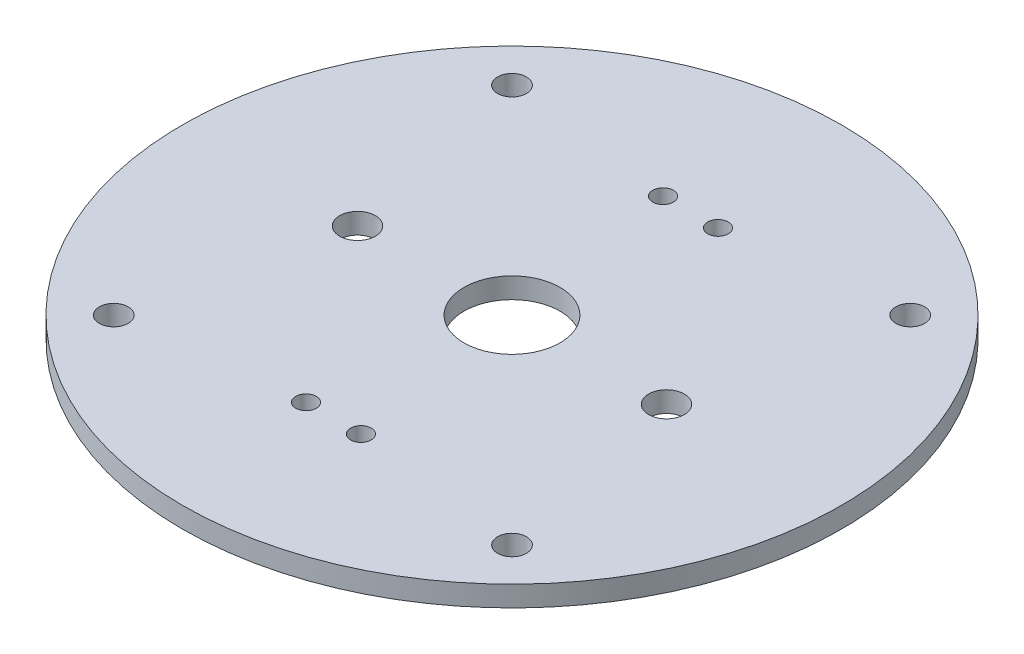
ISO-10303-21;
HEADER;
FILE_DESCRIPTION(('STEP AP214'),'2;1');
FILE_NAME('part.step','',(''),(''),'','','');
FILE_SCHEMA(('AUTOMOTIVE_DESIGN { 1 0 10303 214 1 1 1 1 }'));
ENDSEC;
DATA;
#1=APPLICATION_CONTEXT('core data for automotive mechanical design processes');
#2=APPLICATION_PROTOCOL_DEFINITION('international standard','automotive_design',2000,#1);
#3=PRODUCT_CONTEXT('',#1,'mechanical');
#4=PRODUCT('Part','Part','',(#3));
#5=PRODUCT_RELATED_PRODUCT_CATEGORY('part','',(#4));
#6=PRODUCT_DEFINITION_FORMATION('','',#4);
#7=PRODUCT_DEFINITION_CONTEXT('part definition',#1,'design');
#8=PRODUCT_DEFINITION('design','',#6,#7);
#9=PRODUCT_DEFINITION_SHAPE('','',#8);
#10=(LENGTH_UNIT() NAMED_UNIT(*) SI_UNIT(.MILLI.,.METRE.));
#11=(NAMED_UNIT(*) PLANE_ANGLE_UNIT() SI_UNIT($,.RADIAN.));
#12=(NAMED_UNIT(*) SI_UNIT($,.STERADIAN.) SOLID_ANGLE_UNIT());
#13=UNCERTAINTY_MEASURE_WITH_UNIT(LENGTH_MEASURE(1.E-05),#10,'distance_accuracy_value','');
#14=(GEOMETRIC_REPRESENTATION_CONTEXT(3) GLOBAL_UNCERTAINTY_ASSIGNED_CONTEXT((#13)) GLOBAL_UNIT_ASSIGNED_CONTEXT((#10,
#11,#12)) REPRESENTATION_CONTEXT('',''));
#15=CARTESIAN_POINT('',(0.,0.,0.));
#16=DIRECTION('',(0.,0.,1.));
#17=DIRECTION('',(1.,0.,0.));
#18=AXIS2_PLACEMENT_3D('',#15,#16,#17);
#19=CARTESIAN_POINT('',(0.,3.,0.));
#20=DIRECTION('',(0.,1.,0.));
#21=DIRECTION('',(0.,0.,1.));
#22=AXIS2_PLACEMENT_3D('',#19,#20,#21);
#23=PLANE('',#22);
#24=CARTESIAN_POINT('',(4.00000000000001,3.,26.));
#25=DIRECTION('',(0.,1.,0.));
#26=DIRECTION('',(0.,0.,1.));
#27=AXIS2_PLACEMENT_3D('',#24,#25,#26);
#28=CIRCLE('',#27,1.5);
#29=CARTESIAN_POINT('',(4.00000000000001,3.,27.5));
#30=VERTEX_POINT('',#29);
#31=EDGE_CURVE('E130',#30,#30,#28,.T.);
#32=ORIENTED_EDGE('',*,*,#31,.F.);
#33=EDGE_LOOP('',(#32));
#34=FACE_BOUND('',#33,.T.);
#35=CARTESIAN_POINT('',(-3.99999999999999,3.,26.));
#36=DIRECTION('',(0.,1.,0.));
#37=DIRECTION('',(0.,0.,1.));
#38=AXIS2_PLACEMENT_3D('',#35,#36,#37);
#39=CIRCLE('',#38,1.5);
#40=CARTESIAN_POINT('',(-3.99999999999999,3.,27.5));
#41=VERTEX_POINT('',#40);
#42=EDGE_CURVE('E134',#41,#41,#39,.T.);
#43=ORIENTED_EDGE('',*,*,#42,.F.);
#44=EDGE_LOOP('',(#43));
#45=FACE_BOUND('',#44,.T.);
#46=CARTESIAN_POINT('',(-3.99999999999999,3.,-26.));
#47=DIRECTION('',(0.,1.,0.));
#48=DIRECTION('',(0.,0.,1.));
#49=AXIS2_PLACEMENT_3D('',#46,#47,#48);
#50=CIRCLE('',#49,1.5);
#51=CARTESIAN_POINT('',(-3.99999999999999,3.,-24.5));
#52=VERTEX_POINT('',#51);
#53=EDGE_CURVE('E138',#52,#52,#50,.T.);
#54=ORIENTED_EDGE('',*,*,#53,.F.);
#55=EDGE_LOOP('',(#54));
#56=FACE_BOUND('',#55,.T.);
#57=CARTESIAN_POINT('',(4.00000000000001,3.,-26.));
#58=DIRECTION('',(0.,1.,0.));
#59=DIRECTION('',(0.,0.,1.));
#60=AXIS2_PLACEMENT_3D('',#57,#58,#59);
#61=CIRCLE('',#60,1.5);
#62=CARTESIAN_POINT('',(4.00000000000001,3.,-24.5));
#63=VERTEX_POINT('',#62);
#64=EDGE_CURVE('E56',#63,#63,#61,.T.);
#65=ORIENTED_EDGE('',*,*,#64,.F.);
#66=EDGE_LOOP('',(#65));
#67=FACE_BOUND('',#66,.T.);
#68=CARTESIAN_POINT('',(22.5,3.,0.));
#69=DIRECTION('',(0.,1.,0.));
#70=DIRECTION('',(0.,0.,1.));
#71=AXIS2_PLACEMENT_3D('',#68,#69,#70);
#72=CIRCLE('',#71,2.6);
#73=CARTESIAN_POINT('',(22.5,3.,2.6));
#74=VERTEX_POINT('',#73);
#75=EDGE_CURVE('E63',#74,#74,#72,.T.);
#76=ORIENTED_EDGE('',*,*,#75,.F.);
#77=EDGE_LOOP('',(#76));
#78=FACE_BOUND('',#77,.T.);
#79=CARTESIAN_POINT('',(-22.5,3.,0.));
#80=DIRECTION('',(0.,1.,0.));
#81=DIRECTION('',(0.,0.,1.));
#82=AXIS2_PLACEMENT_3D('',#79,#80,#81);
#83=CIRCLE('',#82,2.6);
#84=CARTESIAN_POINT('',(-22.5,3.,2.6));
#85=VERTEX_POINT('',#84);
#86=EDGE_CURVE('E72',#85,#85,#83,.T.);
#87=ORIENTED_EDGE('',*,*,#86,.F.);
#88=EDGE_LOOP('',(#87));
#89=FACE_BOUND('',#88,.T.);
#90=CARTESIAN_POINT('',(0.,3.,0.));
#91=DIRECTION('',(0.,1.,0.));
#92=DIRECTION('',(0.,0.,1.));
#93=AXIS2_PLACEMENT_3D('',#90,#91,#92);
#94=CIRCLE('',#93,7.);
#95=CARTESIAN_POINT('',(0.,3.,7.));
#96=VERTEX_POINT('',#95);
#97=EDGE_CURVE('E80',#96,#96,#94,.T.);
#98=ORIENTED_EDGE('',*,*,#97,.F.);
#99=EDGE_LOOP('',(#98));
#100=FACE_BOUND('',#99,.T.);
#101=CARTESIAN_POINT('',(29.,3.,29.));
#102=DIRECTION('',(0.,1.,0.));
#103=DIRECTION('',(0.,0.,1.));
#104=AXIS2_PLACEMENT_3D('',#101,#102,#103);
#105=CIRCLE('',#104,2.1);
#106=CARTESIAN_POINT('',(29.,3.,31.1));
#107=VERTEX_POINT('',#106);
#108=EDGE_CURVE('E90',#107,#107,#105,.T.);
#109=ORIENTED_EDGE('',*,*,#108,.F.);
#110=EDGE_LOOP('',(#109));
#111=FACE_BOUND('',#110,.T.);
#112=CARTESIAN_POINT('',(-29.,3.,-29.));
#113=DIRECTION('',(0.,1.,0.));
#114=DIRECTION('',(0.,0.,1.));
#115=AXIS2_PLACEMENT_3D('',#112,#113,#114);
#116=CIRCLE('',#115,2.1);
#117=CARTESIAN_POINT('',(-29.,3.,-26.9));
#118=VERTEX_POINT('',#117);
#119=EDGE_CURVE('E46',#118,#118,#116,.T.);
#120=ORIENTED_EDGE('',*,*,#119,.F.);
#121=EDGE_LOOP('',(#120));
#122=FACE_BOUND('',#121,.T.);
#123=CARTESIAN_POINT('',(0.,3.,0.));
#124=DIRECTION('',(0.,1.,0.));
#125=DIRECTION('',(0.,0.,1.));
#126=AXIS2_PLACEMENT_3D('',#123,#124,#125);
#127=CIRCLE('',#126,48.);
#128=CARTESIAN_POINT('',(0.,3.,48.));
#129=VERTEX_POINT('',#128);
#130=EDGE_CURVE('E10',#129,#129,#127,.T.);
#131=ORIENTED_EDGE('',*,*,#130,.T.);
#132=EDGE_LOOP('',(#131));
#133=FACE_BOUND('',#132,.T.);
#134=CARTESIAN_POINT('',(29.,3.,-29.));
#135=DIRECTION('',(0.,1.,0.));
#136=DIRECTION('',(0.,0.,1.));
#137=AXIS2_PLACEMENT_3D('',#134,#135,#136);
#138=CIRCLE('',#137,2.1);
#139=CARTESIAN_POINT('',(29.,3.,-26.9));
#140=VERTEX_POINT('',#139);
#141=EDGE_CURVE('E96',#140,#140,#138,.T.);
#142=ORIENTED_EDGE('',*,*,#141,.F.);
#143=EDGE_LOOP('',(#142));
#144=FACE_BOUND('',#143,.T.);
#145=CARTESIAN_POINT('',(-29.,3.,29.));
#146=DIRECTION('',(0.,1.,0.));
#147=DIRECTION('',(0.,0.,1.));
#148=AXIS2_PLACEMENT_3D('',#145,#146,#147);
#149=CIRCLE('',#148,2.1);
#150=CARTESIAN_POINT('',(-29.,3.,31.1));
#151=VERTEX_POINT('',#150);
#152=EDGE_CURVE('E84',#151,#151,#149,.T.);
#153=ORIENTED_EDGE('',*,*,#152,.F.);
#154=EDGE_LOOP('',(#153));
#155=FACE_BOUND('',#154,.T.);
#156=ADVANCED_FACE('F33',(#34,#45,#56,#67,#78,#89,#100,#111,#122,#133,#144,#155),#23,.T.);
#157=CARTESIAN_POINT('',(0.,0.,0.));
#158=DIRECTION('',(0.,1.,0.));
#159=DIRECTION('',(0.,0.,1.));
#160=AXIS2_PLACEMENT_3D('',#157,#158,#159);
#161=PLANE('',#160);
#162=CARTESIAN_POINT('',(4.00000000000001,0.,26.));
#163=DIRECTION('',(0.,1.,0.));
#164=DIRECTION('',(0.,0.,1.));
#165=AXIS2_PLACEMENT_3D('',#162,#163,#164);
#166=CIRCLE('',#165,1.5);
#167=CARTESIAN_POINT('',(4.00000000000001,0.,27.5));
#168=VERTEX_POINT('',#167);
#169=EDGE_CURVE('E37',#168,#168,#166,.T.);
#170=ORIENTED_EDGE('',*,*,#169,.T.);
#171=EDGE_LOOP('',(#170));
#172=FACE_BOUND('',#171,.T.);
#173=CARTESIAN_POINT('',(-3.99999999999999,0.,26.));
#174=DIRECTION('',(0.,1.,0.));
#175=DIRECTION('',(0.,0.,1.));
#176=AXIS2_PLACEMENT_3D('',#173,#174,#175);
#177=CIRCLE('',#176,1.5);
#178=CARTESIAN_POINT('',(-3.99999999999999,0.,27.5));
#179=VERTEX_POINT('',#178);
#180=EDGE_CURVE('E58',#179,#179,#177,.T.);
#181=ORIENTED_EDGE('',*,*,#180,.T.);
#182=EDGE_LOOP('',(#181));
#183=FACE_BOUND('',#182,.T.);
#184=CARTESIAN_POINT('',(-3.99999999999999,0.,-26.));
#185=DIRECTION('',(0.,1.,0.));
#186=DIRECTION('',(0.,0.,1.));
#187=AXIS2_PLACEMENT_3D('',#184,#185,#186);
#188=CIRCLE('',#187,1.5);
#189=CARTESIAN_POINT('',(-3.99999999999999,0.,-24.5));
#190=VERTEX_POINT('',#189);
#191=EDGE_CURVE('E55',#190,#190,#188,.T.);
#192=ORIENTED_EDGE('',*,*,#191,.T.);
#193=EDGE_LOOP('',(#192));
#194=FACE_BOUND('',#193,.T.);
#195=CARTESIAN_POINT('',(4.00000000000001,0.,-26.));
#196=DIRECTION('',(0.,1.,0.));
#197=DIRECTION('',(0.,0.,1.));
#198=AXIS2_PLACEMENT_3D('',#195,#196,#197);
#199=CIRCLE('',#198,1.5);
#200=CARTESIAN_POINT('',(4.00000000000001,0.,-24.5));
#201=VERTEX_POINT('',#200);
#202=EDGE_CURVE('E52',#201,#201,#199,.T.);
#203=ORIENTED_EDGE('',*,*,#202,.T.);
#204=EDGE_LOOP('',(#203));
#205=FACE_BOUND('',#204,.T.);
#206=CARTESIAN_POINT('',(22.5,0.,0.));
#207=DIRECTION('',(0.,1.,0.));
#208=DIRECTION('',(0.,0.,1.));
#209=AXIS2_PLACEMENT_3D('',#206,#207,#208);
#210=CIRCLE('',#209,2.6);
#211=CARTESIAN_POINT('',(22.5,0.,2.6));
#212=VERTEX_POINT('',#211);
#213=EDGE_CURVE('E67',#212,#212,#210,.T.);
#214=ORIENTED_EDGE('',*,*,#213,.T.);
#215=EDGE_LOOP('',(#214));
#216=FACE_BOUND('',#215,.T.);
#217=CARTESIAN_POINT('',(-22.5,0.,0.));
#218=DIRECTION('',(0.,1.,0.));
#219=DIRECTION('',(0.,0.,1.));
#220=AXIS2_PLACEMENT_3D('',#217,#218,#219);
#221=CIRCLE('',#220,2.6);
#222=CARTESIAN_POINT('',(-22.5,0.,2.6));
#223=VERTEX_POINT('',#222);
#224=EDGE_CURVE('E83',#223,#223,#221,.T.);
#225=ORIENTED_EDGE('',*,*,#224,.T.);
#226=EDGE_LOOP('',(#225));
#227=FACE_BOUND('',#226,.T.);
#228=CARTESIAN_POINT('',(0.,0.,0.));
#229=DIRECTION('',(0.,1.,0.));
#230=DIRECTION('',(0.,0.,1.));
#231=AXIS2_PLACEMENT_3D('',#228,#229,#230);
#232=CIRCLE('',#231,7.);
#233=CARTESIAN_POINT('',(0.,0.,7.));
#234=VERTEX_POINT('',#233);
#235=EDGE_CURVE('E76',#234,#234,#232,.T.);
#236=ORIENTED_EDGE('',*,*,#235,.T.);
#237=EDGE_LOOP('',(#236));
#238=FACE_BOUND('',#237,.T.);
#239=CARTESIAN_POINT('',(0.,0.,0.));
#240=DIRECTION('',(0.,1.,0.));
#241=DIRECTION('',(0.,0.,1.));
#242=AXIS2_PLACEMENT_3D('',#239,#240,#241);
#243=CIRCLE('',#242,48.);
#244=CARTESIAN_POINT('',(0.,0.,48.));
#245=VERTEX_POINT('',#244);
#246=EDGE_CURVE('E41',#245,#245,#243,.T.);
#247=ORIENTED_EDGE('',*,*,#246,.F.);
#248=EDGE_LOOP('',(#247));
#249=FACE_BOUND('',#248,.T.);
#250=CARTESIAN_POINT('',(-29.,0.,-29.));
#251=DIRECTION('',(0.,1.,0.));
#252=DIRECTION('',(0.,0.,1.));
#253=AXIS2_PLACEMENT_3D('',#250,#251,#252);
#254=CIRCLE('',#253,2.1);
#255=CARTESIAN_POINT('',(-29.,0.,-26.9));
#256=VERTEX_POINT('',#255);
#257=EDGE_CURVE('E49',#256,#256,#254,.T.);
#258=ORIENTED_EDGE('',*,*,#257,.T.);
#259=EDGE_LOOP('',(#258));
#260=FACE_BOUND('',#259,.T.);
#261=CARTESIAN_POINT('',(29.,0.,-29.));
#262=DIRECTION('',(0.,1.,0.));
#263=DIRECTION('',(0.,0.,1.));
#264=AXIS2_PLACEMENT_3D('',#261,#262,#263);
#265=CIRCLE('',#264,2.1);
#266=CARTESIAN_POINT('',(29.,0.,-26.9));
#267=VERTEX_POINT('',#266);
#268=EDGE_CURVE('E93',#267,#267,#265,.T.);
#269=ORIENTED_EDGE('',*,*,#268,.T.);
#270=EDGE_LOOP('',(#269));
#271=FACE_BOUND('',#270,.T.);
#272=CARTESIAN_POINT('',(29.,0.,29.));
#273=DIRECTION('',(0.,1.,0.));
#274=DIRECTION('',(0.,0.,1.));
#275=AXIS2_PLACEMENT_3D('',#272,#273,#274);
#276=CIRCLE('',#275,2.1);
#277=CARTESIAN_POINT('',(29.,0.,31.1));
#278=VERTEX_POINT('',#277);
#279=EDGE_CURVE('E87',#278,#278,#276,.T.);
#280=ORIENTED_EDGE('',*,*,#279,.T.);
#281=EDGE_LOOP('',(#280));
#282=FACE_BOUND('',#281,.T.);
#283=CARTESIAN_POINT('',(-29.,0.,29.));
#284=DIRECTION('',(0.,1.,0.));
#285=DIRECTION('',(0.,0.,1.));
#286=AXIS2_PLACEMENT_3D('',#283,#284,#285);
#287=CIRCLE('',#286,2.1);
#288=CARTESIAN_POINT('',(-29.,0.,31.1));
#289=VERTEX_POINT('',#288);
#290=EDGE_CURVE('E79',#289,#289,#287,.T.);
#291=ORIENTED_EDGE('',*,*,#290,.T.);
#292=EDGE_LOOP('',(#291));
#293=FACE_BOUND('',#292,.T.);
#294=ADVANCED_FACE('F106',(#172,#183,#194,#205,#216,#227,#238,#249,#260,#271,#282,#293),#161,.F.);
#295=CARTESIAN_POINT('',(0.,3.,0.));
#296=DIRECTION('',(0.,-1.,0.));
#297=DIRECTION('',(0.,0.,-1.));
#298=AXIS2_PLACEMENT_3D('',#295,#296,#297);
#299=CYLINDRICAL_SURFACE('',#298,48.);
#300=ORIENTED_EDGE('',*,*,#130,.F.);
#301=EDGE_LOOP('',(#300));
#302=FACE_BOUND('',#301,.T.);
#303=ORIENTED_EDGE('',*,*,#246,.T.);
#304=EDGE_LOOP('',(#303));
#305=FACE_BOUND('',#304,.T.);
#306=ADVANCED_FACE('F35',(#302,#305),#299,.T.);
#307=CARTESIAN_POINT('',(-29.,3.,-29.));
#308=DIRECTION('',(0.,-1.,0.));
#309=DIRECTION('',(0.,0.,-1.));
#310=AXIS2_PLACEMENT_3D('',#307,#308,#309);
#311=CYLINDRICAL_SURFACE('',#310,2.1);
#312=ORIENTED_EDGE('',*,*,#119,.T.);
#313=EDGE_LOOP('',(#312));
#314=FACE_BOUND('',#313,.T.);
#315=ORIENTED_EDGE('',*,*,#257,.F.);
#316=EDGE_LOOP('',(#315));
#317=FACE_BOUND('',#316,.T.);
#318=ADVANCED_FACE('F109',(#314,#317),#311,.F.);
#319=CARTESIAN_POINT('',(29.,3.,-29.));
#320=DIRECTION('',(0.,-1.,0.));
#321=DIRECTION('',(0.,0.,-1.));
#322=AXIS2_PLACEMENT_3D('',#319,#320,#321);
#323=CYLINDRICAL_SURFACE('',#322,2.1);
#324=ORIENTED_EDGE('',*,*,#141,.T.);
#325=EDGE_LOOP('',(#324));
#326=FACE_BOUND('',#325,.T.);
#327=ORIENTED_EDGE('',*,*,#268,.F.);
#328=EDGE_LOOP('',(#327));
#329=FACE_BOUND('',#328,.T.);
#330=ADVANCED_FACE('F111',(#326,#329),#323,.F.);
#331=CARTESIAN_POINT('',(29.,3.,29.));
#332=DIRECTION('',(0.,-1.,0.));
#333=DIRECTION('',(0.,0.,-1.));
#334=AXIS2_PLACEMENT_3D('',#331,#332,#333);
#335=CYLINDRICAL_SURFACE('',#334,2.1);
#336=ORIENTED_EDGE('',*,*,#108,.T.);
#337=EDGE_LOOP('',(#336));
#338=FACE_BOUND('',#337,.T.);
#339=ORIENTED_EDGE('',*,*,#279,.F.);
#340=EDGE_LOOP('',(#339));
#341=FACE_BOUND('',#340,.T.);
#342=ADVANCED_FACE('F117',(#338,#341),#335,.F.);
#343=CARTESIAN_POINT('',(-29.,3.,29.));
#344=DIRECTION('',(0.,-1.,0.));
#345=DIRECTION('',(0.,0.,-1.));
#346=AXIS2_PLACEMENT_3D('',#343,#344,#345);
#347=CYLINDRICAL_SURFACE('',#346,2.1);
#348=ORIENTED_EDGE('',*,*,#152,.T.);
#349=EDGE_LOOP('',(#348));
#350=FACE_BOUND('',#349,.T.);
#351=ORIENTED_EDGE('',*,*,#290,.F.);
#352=EDGE_LOOP('',(#351));
#353=FACE_BOUND('',#352,.T.);
#354=ADVANCED_FACE('F155',(#350,#353),#347,.F.);
#355=CARTESIAN_POINT('',(0.,0.,0.));
#356=DIRECTION('',(0.,1.,0.));
#357=DIRECTION('',(0.,0.,1.));
#358=AXIS2_PLACEMENT_3D('',#355,#356,#357);
#359=CYLINDRICAL_SURFACE('',#358,7.);
#360=ORIENTED_EDGE('',*,*,#235,.F.);
#361=EDGE_LOOP('',(#360));
#362=FACE_BOUND('',#361,.T.);
#363=ORIENTED_EDGE('',*,*,#97,.T.);
#364=EDGE_LOOP('',(#363));
#365=FACE_BOUND('',#364,.T.);
#366=ADVANCED_FACE('F158',(#362,#365),#359,.F.);
#367=CARTESIAN_POINT('',(-22.5,0.,0.));
#368=DIRECTION('',(0.,1.,0.));
#369=DIRECTION('',(0.,0.,1.));
#370=AXIS2_PLACEMENT_3D('',#367,#368,#369);
#371=CYLINDRICAL_SURFACE('',#370,2.6);
#372=ORIENTED_EDGE('',*,*,#224,.F.);
#373=EDGE_LOOP('',(#372));
#374=FACE_BOUND('',#373,.T.);
#375=ORIENTED_EDGE('',*,*,#86,.T.);
#376=EDGE_LOOP('',(#375));
#377=FACE_BOUND('',#376,.T.);
#378=ADVANCED_FACE('F166',(#374,#377),#371,.F.);
#379=CARTESIAN_POINT('',(22.5,0.,0.));
#380=DIRECTION('',(0.,1.,0.));
#381=DIRECTION('',(0.,0.,1.));
#382=AXIS2_PLACEMENT_3D('',#379,#380,#381);
#383=CYLINDRICAL_SURFACE('',#382,2.6);
#384=ORIENTED_EDGE('',*,*,#213,.F.);
#385=EDGE_LOOP('',(#384));
#386=FACE_BOUND('',#385,.T.);
#387=ORIENTED_EDGE('',*,*,#75,.T.);
#388=EDGE_LOOP('',(#387));
#389=FACE_BOUND('',#388,.T.);
#390=ADVANCED_FACE('F172',(#386,#389),#383,.F.);
#391=CARTESIAN_POINT('',(4.00000000000001,-7.,-26.));
#392=DIRECTION('',(0.,1.,0.));
#393=DIRECTION('',(0.,0.,1.));
#394=AXIS2_PLACEMENT_3D('',#391,#392,#393);
#395=CYLINDRICAL_SURFACE('',#394,1.5);
#396=ORIENTED_EDGE('',*,*,#64,.T.);
#397=EDGE_LOOP('',(#396));
#398=FACE_BOUND('',#397,.T.);
#399=ORIENTED_EDGE('',*,*,#202,.F.);
#400=EDGE_LOOP('',(#399));
#401=FACE_BOUND('',#400,.T.);
#402=ADVANCED_FACE('F175',(#398,#401),#395,.F.);
#403=CARTESIAN_POINT('',(-3.99999999999999,-7.,-26.));
#404=DIRECTION('',(0.,1.,0.));
#405=DIRECTION('',(0.,0.,1.));
#406=AXIS2_PLACEMENT_3D('',#403,#404,#405);
#407=CYLINDRICAL_SURFACE('',#406,1.5);
#408=ORIENTED_EDGE('',*,*,#53,.T.);
#409=EDGE_LOOP('',(#408));
#410=FACE_BOUND('',#409,.T.);
#411=ORIENTED_EDGE('',*,*,#191,.F.);
#412=EDGE_LOOP('',(#411));
#413=FACE_BOUND('',#412,.T.);
#414=ADVANCED_FACE('F182',(#410,#413),#407,.F.);
#415=CARTESIAN_POINT('',(-3.99999999999999,-7.,26.));
#416=DIRECTION('',(0.,1.,0.));
#417=DIRECTION('',(0.,0.,1.));
#418=AXIS2_PLACEMENT_3D('',#415,#416,#417);
#419=CYLINDRICAL_SURFACE('',#418,1.5);
#420=ORIENTED_EDGE('',*,*,#42,.T.);
#421=EDGE_LOOP('',(#420));
#422=FACE_BOUND('',#421,.T.);
#423=ORIENTED_EDGE('',*,*,#180,.F.);
#424=EDGE_LOOP('',(#423));
#425=FACE_BOUND('',#424,.T.);
#426=ADVANCED_FACE('F187',(#422,#425),#419,.F.);
#427=CARTESIAN_POINT('',(4.00000000000001,-7.,26.));
#428=DIRECTION('',(0.,1.,0.));
#429=DIRECTION('',(0.,0.,1.));
#430=AXIS2_PLACEMENT_3D('',#427,#428,#429);
#431=CYLINDRICAL_SURFACE('',#430,1.5);
#432=ORIENTED_EDGE('',*,*,#31,.T.);
#433=EDGE_LOOP('',(#432));
#434=FACE_BOUND('',#433,.T.);
#435=ORIENTED_EDGE('',*,*,#169,.F.);
#436=EDGE_LOOP('',(#435));
#437=FACE_BOUND('',#436,.T.);
#438=ADVANCED_FACE('F184',(#434,#437),#431,.F.);
#439=CLOSED_SHELL('',(#156,#294,#306,#318,#330,#342,#354,#366,#378,#390,#402,#414,#426,#438));
#440=MANIFOLD_SOLID_BREP('B2',#439);
#441=ADVANCED_BREP_SHAPE_REPRESENTATION('',(#18,#440),#14);
#442=SHAPE_DEFINITION_REPRESENTATION(#9,#441);
ENDSEC;
END-ISO-10303-21;
